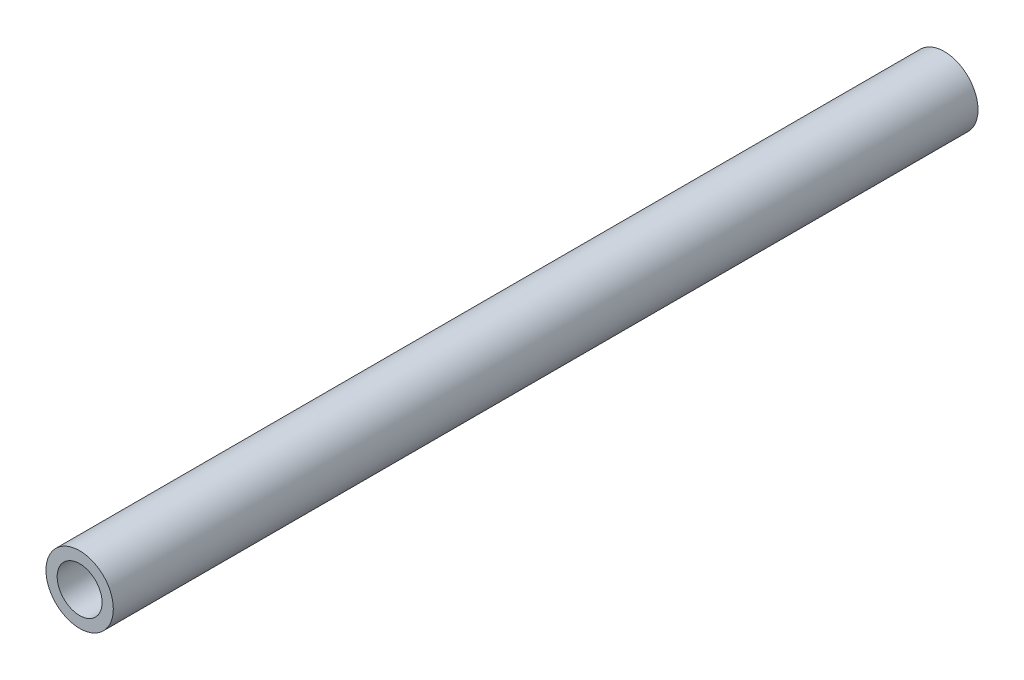
ISO-10303-21;
HEADER;
FILE_DESCRIPTION(('STEP AP214'),'2;1');
FILE_NAME('part.step','',(''),(''),'','','');
FILE_SCHEMA(('AUTOMOTIVE_DESIGN { 1 0 10303 214 1 1 1 1 }'));
ENDSEC;
DATA;
#1=APPLICATION_CONTEXT('core data for automotive mechanical design processes');
#2=APPLICATION_PROTOCOL_DEFINITION('international standard','automotive_design',2000,#1);
#3=PRODUCT_CONTEXT('',#1,'mechanical');
#4=PRODUCT('Part','Part','',(#3));
#5=PRODUCT_RELATED_PRODUCT_CATEGORY('part','',(#4));
#6=PRODUCT_DEFINITION_FORMATION('','',#4);
#7=PRODUCT_DEFINITION_CONTEXT('part definition',#1,'design');
#8=PRODUCT_DEFINITION('design','',#6,#7);
#9=PRODUCT_DEFINITION_SHAPE('','',#8);
#10=(LENGTH_UNIT() NAMED_UNIT(*) SI_UNIT(.MILLI.,.METRE.));
#11=(NAMED_UNIT(*) PLANE_ANGLE_UNIT() SI_UNIT($,.RADIAN.));
#12=(NAMED_UNIT(*) SI_UNIT($,.STERADIAN.) SOLID_ANGLE_UNIT());
#13=UNCERTAINTY_MEASURE_WITH_UNIT(LENGTH_MEASURE(1.E-05),#10,'distance_accuracy_value','');
#14=(GEOMETRIC_REPRESENTATION_CONTEXT(3) GLOBAL_UNCERTAINTY_ASSIGNED_CONTEXT((#13)) GLOBAL_UNIT_ASSIGNED_CONTEXT((#10,
#11,#12)) REPRESENTATION_CONTEXT('',''));
#15=CARTESIAN_POINT('',(0.,0.,0.));
#16=DIRECTION('',(0.,0.,1.));
#17=DIRECTION('',(1.,0.,0.));
#18=AXIS2_PLACEMENT_3D('',#15,#16,#17);
#19=CARTESIAN_POINT('',(0.,0.,488.95));
#20=DIRECTION('',(0.,0.,-1.));
#21=DIRECTION('',(-1.,0.,0.));
#22=AXIS2_PLACEMENT_3D('',#19,#20,#21);
#23=CYLINDRICAL_SURFACE('',#22,19.05);
#24=CARTESIAN_POINT('',(0.,0.,488.95));
#25=DIRECTION('',(0.,0.,1.));
#26=DIRECTION('',(1.,0.,0.));
#27=AXIS2_PLACEMENT_3D('',#24,#25,#26);
#28=CIRCLE('',#27,19.05);
#29=CARTESIAN_POINT('',(19.05,0.,488.95));
#30=VERTEX_POINT('',#29);
#31=EDGE_CURVE('E10',#30,#30,#28,.T.);
#32=ORIENTED_EDGE('',*,*,#31,.F.);
#33=EDGE_LOOP('',(#32));
#34=FACE_BOUND('',#33,.T.);
#35=CARTESIAN_POINT('',(0.,0.,0.));
#36=DIRECTION('',(0.,0.,1.));
#37=DIRECTION('',(1.,0.,0.));
#38=AXIS2_PLACEMENT_3D('',#35,#36,#37);
#39=CIRCLE('',#38,19.05);
#40=CARTESIAN_POINT('',(19.05,0.,0.));
#41=VERTEX_POINT('',#40);
#42=EDGE_CURVE('E38',#41,#41,#39,.T.);
#43=ORIENTED_EDGE('',*,*,#42,.T.);
#44=EDGE_LOOP('',(#43));
#45=FACE_BOUND('',#44,.T.);
#46=ADVANCED_FACE('F31',(#34,#45),#23,.T.);
#47=CARTESIAN_POINT('',(0.,0.,488.95));
#48=DIRECTION('',(0.,0.,1.));
#49=DIRECTION('',(1.,0.,0.));
#50=AXIS2_PLACEMENT_3D('',#47,#48,#49);
#51=PLANE('',#50);
#52=CARTESIAN_POINT('',(0.,0.,488.95));
#53=DIRECTION('',(0.,0.,1.));
#54=DIRECTION('',(1.,0.,0.));
#55=AXIS2_PLACEMENT_3D('',#52,#53,#54);
#56=CIRCLE('',#55,12.7);
#57=CARTESIAN_POINT('',(12.7,0.,488.95));
#58=VERTEX_POINT('',#57);
#59=EDGE_CURVE('E44',#58,#58,#56,.T.);
#60=ORIENTED_EDGE('',*,*,#59,.F.);
#61=EDGE_LOOP('',(#60));
#62=FACE_BOUND('',#61,.T.);
#63=ORIENTED_EDGE('',*,*,#31,.T.);
#64=EDGE_LOOP('',(#63));
#65=FACE_BOUND('',#64,.T.);
#66=ADVANCED_FACE('F60',(#62,#65),#51,.T.);
#67=CARTESIAN_POINT('',(0.,0.,0.));
#68=DIRECTION('',(0.,0.,1.));
#69=DIRECTION('',(1.,0.,0.));
#70=AXIS2_PLACEMENT_3D('',#67,#68,#69);
#71=PLANE('',#70);
#72=CARTESIAN_POINT('',(0.,0.,0.));
#73=DIRECTION('',(0.,0.,1.));
#74=DIRECTION('',(1.,0.,0.));
#75=AXIS2_PLACEMENT_3D('',#72,#73,#74);
#76=CIRCLE('',#75,12.7);
#77=CARTESIAN_POINT('',(12.7,0.,0.));
#78=VERTEX_POINT('',#77);
#79=EDGE_CURVE('E34',#78,#78,#76,.T.);
#80=ORIENTED_EDGE('',*,*,#79,.T.);
#81=EDGE_LOOP('',(#80));
#82=FACE_BOUND('',#81,.T.);
#83=ORIENTED_EDGE('',*,*,#42,.F.);
#84=EDGE_LOOP('',(#83));
#85=FACE_BOUND('',#84,.T.);
#86=ADVANCED_FACE('F51',(#82,#85),#71,.F.);
#87=CARTESIAN_POINT('',(0.,0.,-50.8));
#88=DIRECTION('',(0.,0.,1.));
#89=DIRECTION('',(1.,0.,0.));
#90=AXIS2_PLACEMENT_3D('',#87,#88,#89);
#91=CYLINDRICAL_SURFACE('',#90,12.7);
#92=ORIENTED_EDGE('',*,*,#59,.T.);
#93=EDGE_LOOP('',(#92));
#94=FACE_BOUND('',#93,.T.);
#95=ORIENTED_EDGE('',*,*,#79,.F.);
#96=EDGE_LOOP('',(#95));
#97=FACE_BOUND('',#96,.T.);
#98=ADVANCED_FACE('F54',(#94,#97),#91,.F.);
#99=CLOSED_SHELL('',(#46,#66,#86,#98));
#100=MANIFOLD_SOLID_BREP('B2',#99);
#101=ADVANCED_BREP_SHAPE_REPRESENTATION('',(#18,#100),#14);
#102=SHAPE_DEFINITION_REPRESENTATION(#9,#101);
ENDSEC;
END-ISO-10303-21;
